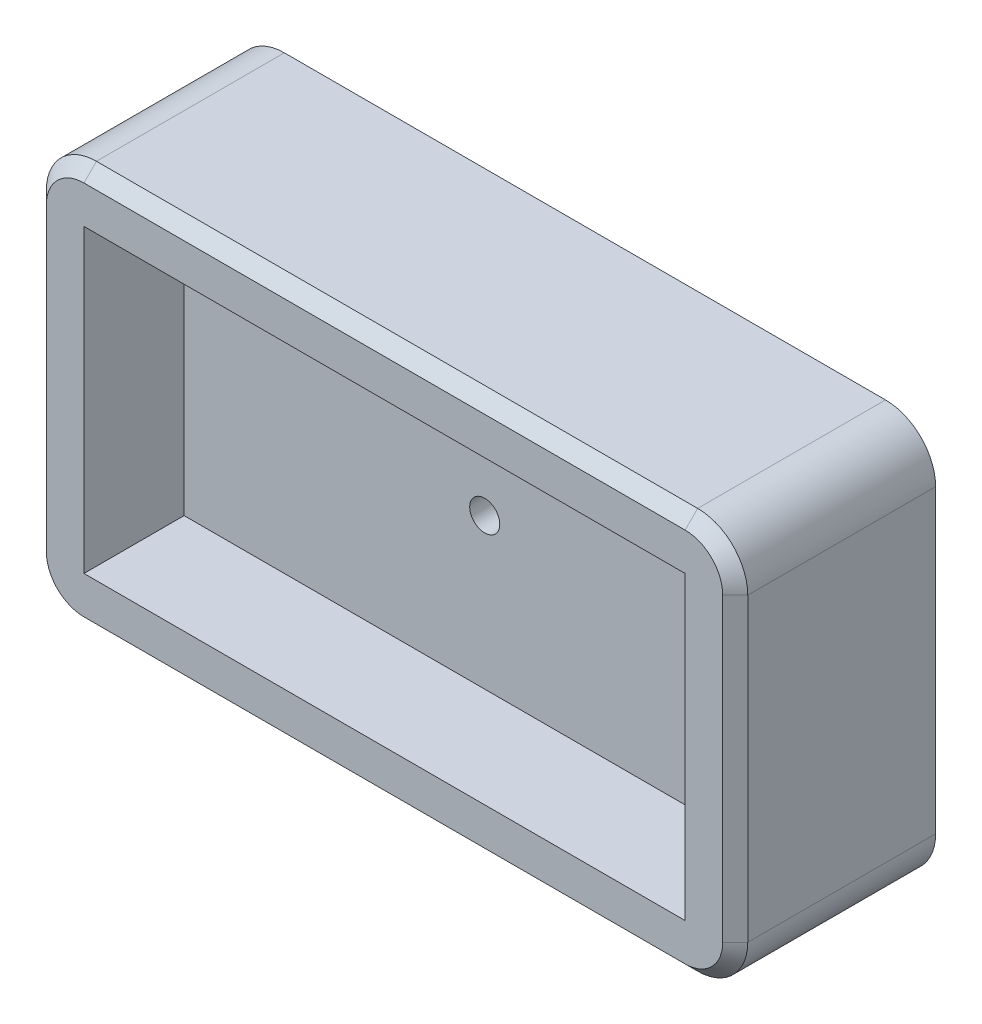
ISO-10303-21;
HEADER;
FILE_DESCRIPTION(('STEP AP214'),'2;1');
FILE_NAME('part.step','',(''),(''),'','','');
FILE_SCHEMA(('AUTOMOTIVE_DESIGN { 1 0 10303 214 1 1 1 1 }'));
ENDSEC;
DATA;
#1=APPLICATION_CONTEXT('core data for automotive mechanical design processes');
#2=APPLICATION_PROTOCOL_DEFINITION('international standard','automotive_design',2000,#1);
#3=PRODUCT_CONTEXT('',#1,'mechanical');
#4=PRODUCT('Part','Part','',(#3));
#5=PRODUCT_RELATED_PRODUCT_CATEGORY('part','',(#4));
#6=PRODUCT_DEFINITION_FORMATION('','',#4);
#7=PRODUCT_DEFINITION_CONTEXT('part definition',#1,'design');
#8=PRODUCT_DEFINITION('design','',#6,#7);
#9=PRODUCT_DEFINITION_SHAPE('','',#8);
#10=(LENGTH_UNIT() NAMED_UNIT(*) SI_UNIT(.MILLI.,.METRE.));
#11=(NAMED_UNIT(*) PLANE_ANGLE_UNIT() SI_UNIT($,.RADIAN.));
#12=(NAMED_UNIT(*) SI_UNIT($,.STERADIAN.) SOLID_ANGLE_UNIT());
#13=UNCERTAINTY_MEASURE_WITH_UNIT(LENGTH_MEASURE(1.E-05),#10,'distance_accuracy_value','');
#14=(GEOMETRIC_REPRESENTATION_CONTEXT(3) GLOBAL_UNCERTAINTY_ASSIGNED_CONTEXT((#13)) GLOBAL_UNIT_ASSIGNED_CONTEXT((#10,
#11,#12)) REPRESENTATION_CONTEXT('',''));
#15=CARTESIAN_POINT('',(0.,0.,0.));
#16=DIRECTION('',(0.,0.,1.));
#17=DIRECTION('',(1.,0.,0.));
#18=AXIS2_PLACEMENT_3D('',#15,#16,#17);
#19=CARTESIAN_POINT('',(0.,25.4,-12.7));
#20=DIRECTION('',(0.,-1.,0.));
#21=DIRECTION('',(1.,0.,0.));
#22=AXIS2_PLACEMENT_3D('',#19,#20,#21);
#23=PLANE('',#22);
#24=DIRECTION('',(0.,0.,1.));
#25=VECTOR('',#24,1.);
#26=CARTESIAN_POINT('',(-38.1,25.4,-12.7));
#27=LINE('',#26,#25);
#28=CARTESIAN_POINT('',(-38.1,25.4,-12.7));
#29=VERTEX_POINT('',#28);
#30=CARTESIAN_POINT('',(-38.1,25.4,11.1125));
#31=VERTEX_POINT('',#30);
#32=EDGE_CURVE('E248',#29,#31,#27,.T.);
#33=ORIENTED_EDGE('',*,*,#32,.T.);
#34=DIRECTION('',(1.,0.,0.));
#35=VECTOR('',#34,1.);
#36=CARTESIAN_POINT('',(0.,25.4,11.1125));
#37=LINE('',#36,#35);
#38=CARTESIAN_POINT('',(38.1,25.4,11.1125));
#39=VERTEX_POINT('',#38);
#40=EDGE_CURVE('E312',#31,#39,#37,.T.);
#41=ORIENTED_EDGE('',*,*,#40,.T.);
#42=DIRECTION('',(0.,0.,1.));
#43=VECTOR('',#42,1.);
#44=CARTESIAN_POINT('',(38.1,25.4,-12.7));
#45=LINE('',#44,#43);
#46=CARTESIAN_POINT('',(38.1,25.4,-12.7));
#47=VERTEX_POINT('',#46);
#48=EDGE_CURVE('E249',#47,#39,#45,.T.);
#49=ORIENTED_EDGE('',*,*,#48,.F.);
#50=DIRECTION('',(1.,0.,0.));
#51=VECTOR('',#50,1.);
#52=CARTESIAN_POINT('',(0.,25.4,-12.7));
#53=LINE('',#52,#51);
#54=EDGE_CURVE('E186',#29,#47,#53,.T.);
#55=ORIENTED_EDGE('',*,*,#54,.F.);
#56=EDGE_LOOP('',(#33,#41,#49,#55));
#57=FACE_BOUND('',#56,.T.);
#58=ADVANCED_FACE('F47',(#57),#23,.F.);
#59=CARTESIAN_POINT('',(38.1,19.05,-12.7));
#60=DIRECTION('',(0.,0.,1.));
#61=DIRECTION('',(1.,0.,0.));
#62=AXIS2_PLACEMENT_3D('',#59,#60,#61);
#63=CYLINDRICAL_SURFACE('',#62,6.35);
#64=ORIENTED_EDGE('',*,*,#48,.T.);
#65=CARTESIAN_POINT('',(38.1,19.05,11.1125));
#66=DIRECTION('',(0.,0.,-1.));
#67=DIRECTION('',(-1.,0.,0.));
#68=AXIS2_PLACEMENT_3D('',#65,#66,#67);
#69=CIRCLE('',#68,6.35);
#70=CARTESIAN_POINT('',(44.45,19.05,11.1125));
#71=VERTEX_POINT('',#70);
#72=EDGE_CURVE('E306',#39,#71,#69,.T.);
#73=ORIENTED_EDGE('',*,*,#72,.T.);
#74=DIRECTION('',(0.,0.,1.));
#75=VECTOR('',#74,1.);
#76=CARTESIAN_POINT('',(44.45,19.05,-12.7));
#77=LINE('',#76,#75);
#78=CARTESIAN_POINT('',(44.45,19.05,-12.7));
#79=VERTEX_POINT('',#78);
#80=EDGE_CURVE('E254',#79,#71,#77,.T.);
#81=ORIENTED_EDGE('',*,*,#80,.F.);
#82=CARTESIAN_POINT('',(38.1,19.05,-12.7));
#83=DIRECTION('',(0.,0.,1.));
#84=DIRECTION('',(1.,0.,0.));
#85=AXIS2_PLACEMENT_3D('',#82,#83,#84);
#86=CIRCLE('',#85,6.35);
#87=EDGE_CURVE('E245',#47,#79,#86,.F.);
#88=ORIENTED_EDGE('',*,*,#87,.F.);
#89=EDGE_LOOP('',(#64,#73,#81,#88));
#90=FACE_BOUND('',#89,.T.);
#91=ADVANCED_FACE('F387',(#90),#63,.T.);
#92=CARTESIAN_POINT('',(44.45,0.,-12.7));
#93=DIRECTION('',(1.,0.,0.));
#94=DIRECTION('',(0.,1.,0.));
#95=AXIS2_PLACEMENT_3D('',#92,#93,#94);
#96=PLANE('',#95);
#97=ORIENTED_EDGE('',*,*,#80,.T.);
#98=DIRECTION('',(0.,-1.,0.));
#99=VECTOR('',#98,1.);
#100=CARTESIAN_POINT('',(44.45,-19.05,11.1125));
#101=LINE('',#100,#99);
#102=CARTESIAN_POINT('',(44.45,-19.05,11.1125));
#103=VERTEX_POINT('',#102);
#104=EDGE_CURVE('E302',#71,#103,#101,.T.);
#105=ORIENTED_EDGE('',*,*,#104,.T.);
#106=DIRECTION('',(0.,0.,1.));
#107=VECTOR('',#106,1.);
#108=CARTESIAN_POINT('',(44.45,-19.05,-12.7));
#109=LINE('',#108,#107);
#110=CARTESIAN_POINT('',(44.45,-19.05,-12.7));
#111=VERTEX_POINT('',#110);
#112=EDGE_CURVE('E258',#111,#103,#109,.T.);
#113=ORIENTED_EDGE('',*,*,#112,.F.);
#114=DIRECTION('',(0.,1.,0.));
#115=VECTOR('',#114,1.);
#116=CARTESIAN_POINT('',(44.45,0.,-12.7));
#117=LINE('',#116,#115);
#118=EDGE_CURVE('E241',#111,#79,#117,.T.);
#119=ORIENTED_EDGE('',*,*,#118,.T.);
#120=EDGE_LOOP('',(#97,#105,#113,#119));
#121=FACE_BOUND('',#120,.T.);
#122=ADVANCED_FACE('F393',(#121),#96,.T.);
#123=CARTESIAN_POINT('',(38.1,-19.05,-12.7));
#124=DIRECTION('',(0.,0.,1.));
#125=DIRECTION('',(1.,0.,0.));
#126=AXIS2_PLACEMENT_3D('',#123,#124,#125);
#127=CYLINDRICAL_SURFACE('',#126,6.35);
#128=ORIENTED_EDGE('',*,*,#112,.T.);
#129=CARTESIAN_POINT('',(38.1,-19.05,11.1125));
#130=DIRECTION('',(0.,0.,-1.));
#131=DIRECTION('',(-1.,0.,0.));
#132=AXIS2_PLACEMENT_3D('',#129,#130,#131);
#133=CIRCLE('',#132,6.35);
#134=CARTESIAN_POINT('',(38.1,-25.4,11.1125));
#135=VERTEX_POINT('',#134);
#136=EDGE_CURVE('E309',#103,#135,#133,.T.);
#137=ORIENTED_EDGE('',*,*,#136,.T.);
#138=DIRECTION('',(0.,0.,1.));
#139=VECTOR('',#138,1.);
#140=CARTESIAN_POINT('',(38.1,-25.4,-12.7));
#141=LINE('',#140,#139);
#142=CARTESIAN_POINT('',(38.1,-25.4,-12.7));
#143=VERTEX_POINT('',#142);
#144=EDGE_CURVE('E262',#143,#135,#141,.T.);
#145=ORIENTED_EDGE('',*,*,#144,.F.);
#146=CARTESIAN_POINT('',(38.1,-19.05,-12.7));
#147=DIRECTION('',(0.,0.,1.));
#148=DIRECTION('',(1.,0.,0.));
#149=AXIS2_PLACEMENT_3D('',#146,#147,#148);
#150=CIRCLE('',#149,6.35);
#151=EDGE_CURVE('E238',#111,#143,#150,.F.);
#152=ORIENTED_EDGE('',*,*,#151,.F.);
#153=EDGE_LOOP('',(#128,#137,#145,#152));
#154=FACE_BOUND('',#153,.T.);
#155=ADVANCED_FACE('F466',(#154),#127,.T.);
#156=CARTESIAN_POINT('',(0.,-25.4,-12.7));
#157=DIRECTION('',(0.,-1.,0.));
#158=DIRECTION('',(0.,0.,-1.));
#159=AXIS2_PLACEMENT_3D('',#156,#157,#158);
#160=PLANE('',#159);
#161=ORIENTED_EDGE('',*,*,#144,.T.);
#162=DIRECTION('',(-1.,0.,0.));
#163=VECTOR('',#162,1.);
#164=CARTESIAN_POINT('',(-38.1,-25.4,11.1125));
#165=LINE('',#164,#163);
#166=CARTESIAN_POINT('',(-38.1,-25.4,11.1125));
#167=VERTEX_POINT('',#166);
#168=EDGE_CURVE('E315',#135,#167,#165,.T.);
#169=ORIENTED_EDGE('',*,*,#168,.T.);
#170=DIRECTION('',(0.,0.,1.));
#171=VECTOR('',#170,1.);
#172=CARTESIAN_POINT('',(-38.1,-25.4,-12.7));
#173=LINE('',#172,#171);
#174=CARTESIAN_POINT('',(-38.1,-25.4,-12.7));
#175=VERTEX_POINT('',#174);
#176=EDGE_CURVE('E266',#175,#167,#173,.T.);
#177=ORIENTED_EDGE('',*,*,#176,.F.);
#178=DIRECTION('',(1.,0.,0.));
#179=VECTOR('',#178,1.);
#180=CARTESIAN_POINT('',(0.,-25.4,-12.7));
#181=LINE('',#180,#179);
#182=EDGE_CURVE('E234',#175,#143,#181,.T.);
#183=ORIENTED_EDGE('',*,*,#182,.T.);
#184=EDGE_LOOP('',(#161,#169,#177,#183));
#185=FACE_BOUND('',#184,.T.);
#186=ADVANCED_FACE('F384',(#185),#160,.T.);
#187=CARTESIAN_POINT('',(-38.1,-19.05,-12.7));
#188=DIRECTION('',(0.,0.,1.));
#189=DIRECTION('',(1.,0.,0.));
#190=AXIS2_PLACEMENT_3D('',#187,#188,#189);
#191=CYLINDRICAL_SURFACE('',#190,6.35);
#192=ORIENTED_EDGE('',*,*,#176,.T.);
#193=CARTESIAN_POINT('',(-38.1,-19.05,11.1125));
#194=DIRECTION('',(0.,0.,-1.));
#195=DIRECTION('',(-1.,0.,0.));
#196=AXIS2_PLACEMENT_3D('',#193,#194,#195);
#197=CIRCLE('',#196,6.35);
#198=CARTESIAN_POINT('',(-44.45,-19.05,11.1125));
#199=VERTEX_POINT('',#198);
#200=EDGE_CURVE('E58',#167,#199,#197,.T.);
#201=ORIENTED_EDGE('',*,*,#200,.T.);
#202=DIRECTION('',(0.,0.,1.));
#203=VECTOR('',#202,1.);
#204=CARTESIAN_POINT('',(-44.45,-19.05,-12.7));
#205=LINE('',#204,#203);
#206=CARTESIAN_POINT('',(-44.45,-19.05,-12.7));
#207=VERTEX_POINT('',#206);
#208=EDGE_CURVE('E269',#207,#199,#205,.T.);
#209=ORIENTED_EDGE('',*,*,#208,.F.);
#210=CARTESIAN_POINT('',(-38.1,-19.05,-12.7));
#211=DIRECTION('',(0.,0.,1.));
#212=DIRECTION('',(1.,0.,0.));
#213=AXIS2_PLACEMENT_3D('',#210,#211,#212);
#214=CIRCLE('',#213,6.35);
#215=EDGE_CURVE('E231',#175,#207,#214,.F.);
#216=ORIENTED_EDGE('',*,*,#215,.F.);
#217=EDGE_LOOP('',(#192,#201,#209,#216));
#218=FACE_BOUND('',#217,.T.);
#219=ADVANCED_FACE('F377',(#218),#191,.T.);
#220=CARTESIAN_POINT('',(-44.45,0.,-12.7));
#221=DIRECTION('',(1.,0.,0.));
#222=DIRECTION('',(0.,0.,-1.));
#223=AXIS2_PLACEMENT_3D('',#220,#221,#222);
#224=PLANE('',#223);
#225=ORIENTED_EDGE('',*,*,#208,.T.);
#226=DIRECTION('',(0.,1.,0.));
#227=VECTOR('',#226,1.);
#228=CARTESIAN_POINT('',(-44.45,0.,11.1125));
#229=LINE('',#228,#227);
#230=CARTESIAN_POINT('',(-44.45,19.05,11.1125));
#231=VERTEX_POINT('',#230);
#232=EDGE_CURVE('E11',#199,#231,#229,.T.);
#233=ORIENTED_EDGE('',*,*,#232,.T.);
#234=DIRECTION('',(0.,0.,1.));
#235=VECTOR('',#234,1.);
#236=CARTESIAN_POINT('',(-44.45,19.05,-12.7));
#237=LINE('',#236,#235);
#238=CARTESIAN_POINT('',(-44.45,19.05,-12.7));
#239=VERTEX_POINT('',#238);
#240=EDGE_CURVE('E272',#239,#231,#237,.T.);
#241=ORIENTED_EDGE('',*,*,#240,.F.);
#242=DIRECTION('',(0.,1.,0.));
#243=VECTOR('',#242,1.);
#244=CARTESIAN_POINT('',(-44.45,0.,-12.7));
#245=LINE('',#244,#243);
#246=EDGE_CURVE('E228',#207,#239,#245,.T.);
#247=ORIENTED_EDGE('',*,*,#246,.F.);
#248=EDGE_LOOP('',(#225,#233,#241,#247));
#249=FACE_BOUND('',#248,.T.);
#250=ADVANCED_FACE('F375',(#249),#224,.F.);
#251=CARTESIAN_POINT('',(-38.1,19.05,-12.7));
#252=DIRECTION('',(0.,0.,1.));
#253=DIRECTION('',(1.,0.,0.));
#254=AXIS2_PLACEMENT_3D('',#251,#252,#253);
#255=CYLINDRICAL_SURFACE('',#254,6.35);
#256=ORIENTED_EDGE('',*,*,#240,.T.);
#257=CARTESIAN_POINT('',(-38.1,19.05,11.1125));
#258=DIRECTION('',(0.,0.,-1.));
#259=DIRECTION('',(-1.,0.,0.));
#260=AXIS2_PLACEMENT_3D('',#257,#258,#259);
#261=CIRCLE('',#260,6.35);
#262=EDGE_CURVE('E318',#231,#31,#261,.T.);
#263=ORIENTED_EDGE('',*,*,#262,.T.);
#264=ORIENTED_EDGE('',*,*,#32,.F.);
#265=CARTESIAN_POINT('',(-38.1,19.05,-12.7));
#266=DIRECTION('',(0.,0.,1.));
#267=DIRECTION('',(1.,0.,0.));
#268=AXIS2_PLACEMENT_3D('',#265,#266,#267);
#269=CIRCLE('',#268,6.35);
#270=EDGE_CURVE('E224',#29,#239,#269,.T.);
#271=ORIENTED_EDGE('',*,*,#270,.T.);
#272=EDGE_LOOP('',(#256,#263,#264,#271));
#273=FACE_BOUND('',#272,.T.);
#274=ADVANCED_FACE('F365',(#273),#255,.T.);
#275=CARTESIAN_POINT('',(0.,0.,-12.7));
#276=DIRECTION('',(0.,0.,1.));
#277=DIRECTION('',(1.,0.,0.));
#278=AXIS2_PLACEMENT_3D('',#275,#276,#277);
#279=PLANE('',#278);
#280=CARTESIAN_POINT('',(0.,0.,-12.7));
#281=DIRECTION('',(0.,0.,-1.));
#282=DIRECTION('',(-1.,0.,0.));
#283=AXIS2_PLACEMENT_3D('',#280,#281,#282);
#284=CIRCLE('',#283,1.905);
#285=CARTESIAN_POINT('',(-1.905,0.,-12.7));
#286=VERTEX_POINT('',#285);
#287=EDGE_CURVE('E511',#286,#286,#284,.T.);
#288=ORIENTED_EDGE('',*,*,#287,.F.);
#289=EDGE_LOOP('',(#288));
#290=FACE_BOUND('',#289,.T.);
#291=ORIENTED_EDGE('',*,*,#54,.T.);
#292=ORIENTED_EDGE('',*,*,#87,.T.);
#293=ORIENTED_EDGE('',*,*,#118,.F.);
#294=ORIENTED_EDGE('',*,*,#151,.T.);
#295=ORIENTED_EDGE('',*,*,#182,.F.);
#296=ORIENTED_EDGE('',*,*,#215,.T.);
#297=ORIENTED_EDGE('',*,*,#246,.T.);
#298=ORIENTED_EDGE('',*,*,#270,.F.);
#299=EDGE_LOOP('',(#291,#292,#293,#294,#295,#296,#297,#298));
#300=FACE_BOUND('',#299,.T.);
#301=ADVANCED_FACE('F371',(#290,#300),#279,.F.);
#302=CARTESIAN_POINT('',(-38.1,-19.05,12.7));
#303=DIRECTION('',(0.,0.,-1.));
#304=DIRECTION('',(-1.,0.,0.));
#305=AXIS2_PLACEMENT_3D('',#302,#303,#304);
#306=PLANE('',#305);
#307=CARTESIAN_POINT('',(38.1,-19.05,12.7));
#308=DIRECTION('',(0.,0.,-1.));
#309=DIRECTION('',(-1.,0.,0.));
#310=AXIS2_PLACEMENT_3D('',#307,#308,#309);
#311=CIRCLE('',#310,4.7625);
#312=CARTESIAN_POINT('',(38.1,-23.8125,12.7));
#313=VERTEX_POINT('',#312);
#314=CARTESIAN_POINT('',(42.8625,-19.05,12.7));
#315=VERTEX_POINT('',#314);
#316=EDGE_CURVE('E292',#313,#315,#311,.F.);
#317=ORIENTED_EDGE('',*,*,#316,.T.);
#318=DIRECTION('',(0.,1.,0.));
#319=VECTOR('',#318,1.);
#320=CARTESIAN_POINT('',(42.8625,19.05,12.7));
#321=LINE('',#320,#319);
#322=CARTESIAN_POINT('',(42.8625,19.05,12.7));
#323=VERTEX_POINT('',#322);
#324=EDGE_CURVE('E298',#315,#323,#321,.T.);
#325=ORIENTED_EDGE('',*,*,#324,.T.);
#326=CARTESIAN_POINT('',(38.1,19.05,12.7));
#327=DIRECTION('',(0.,0.,-1.));
#328=DIRECTION('',(-1.,0.,0.));
#329=AXIS2_PLACEMENT_3D('',#326,#327,#328);
#330=CIRCLE('',#329,4.7625);
#331=CARTESIAN_POINT('',(38.1,23.8125,12.7));
#332=VERTEX_POINT('',#331);
#333=EDGE_CURVE('E295',#323,#332,#330,.F.);
#334=ORIENTED_EDGE('',*,*,#333,.T.);
#335=DIRECTION('',(-1.,0.,0.));
#336=VECTOR('',#335,1.);
#337=CARTESIAN_POINT('',(-38.1,23.8125,12.7));
#338=LINE('',#337,#336);
#339=CARTESIAN_POINT('',(-38.1,23.8125,12.7));
#340=VERTEX_POINT('',#339);
#341=EDGE_CURVE('E289',#332,#340,#338,.T.);
#342=ORIENTED_EDGE('',*,*,#341,.T.);
#343=CARTESIAN_POINT('',(-38.1,19.05,12.7));
#344=DIRECTION('',(0.,0.,-1.));
#345=DIRECTION('',(-1.,0.,0.));
#346=AXIS2_PLACEMENT_3D('',#343,#344,#345);
#347=CIRCLE('',#346,4.7625);
#348=CARTESIAN_POINT('',(-42.8625,19.05,12.7));
#349=VERTEX_POINT('',#348);
#350=EDGE_CURVE('E283',#340,#349,#347,.F.);
#351=ORIENTED_EDGE('',*,*,#350,.T.);
#352=DIRECTION('',(0.,-1.,0.));
#353=VECTOR('',#352,1.);
#354=CARTESIAN_POINT('',(-42.8625,-19.05,12.7));
#355=LINE('',#354,#353);
#356=CARTESIAN_POINT('',(-42.8625,-19.05,12.7));
#357=VERTEX_POINT('',#356);
#358=EDGE_CURVE('E253',#349,#357,#355,.T.);
#359=ORIENTED_EDGE('',*,*,#358,.T.);
#360=CARTESIAN_POINT('',(-38.1,-19.05,12.7));
#361=DIRECTION('',(0.,0.,-1.));
#362=DIRECTION('',(-1.,0.,0.));
#363=AXIS2_PLACEMENT_3D('',#360,#361,#362);
#364=CIRCLE('',#363,4.7625);
#365=CARTESIAN_POINT('',(-38.1,-23.8125,12.7));
#366=VERTEX_POINT('',#365);
#367=EDGE_CURVE('E280',#357,#366,#364,.F.);
#368=ORIENTED_EDGE('',*,*,#367,.T.);
#369=DIRECTION('',(1.,0.,0.));
#370=VECTOR('',#369,1.);
#371=CARTESIAN_POINT('',(38.1,-23.8125,12.7));
#372=LINE('',#371,#370);
#373=EDGE_CURVE('E286',#366,#313,#372,.T.);
#374=ORIENTED_EDGE('',*,*,#373,.T.);
#375=EDGE_LOOP('',(#317,#325,#334,#342,#351,#359,#368,#374));
#376=FACE_BOUND('',#375,.T.);
#377=DIRECTION('',(0.,1.,0.));
#378=VECTOR('',#377,1.);
#379=CARTESIAN_POINT('',(38.1,-19.05,12.7));
#380=LINE('',#379,#378);
#381=CARTESIAN_POINT('',(38.1,-19.05,12.7));
#382=VERTEX_POINT('',#381);
#383=CARTESIAN_POINT('',(38.1,19.05,12.7));
#384=VERTEX_POINT('',#383);
#385=EDGE_CURVE('E165',#382,#384,#380,.T.);
#386=ORIENTED_EDGE('',*,*,#385,.F.);
#387=DIRECTION('',(1.,0.,0.));
#388=VECTOR('',#387,1.);
#389=CARTESIAN_POINT('',(-38.1,-19.05,12.7));
#390=LINE('',#389,#388);
#391=CARTESIAN_POINT('',(-38.1,-19.05,12.7));
#392=VERTEX_POINT('',#391);
#393=EDGE_CURVE('E196',#392,#382,#390,.T.);
#394=ORIENTED_EDGE('',*,*,#393,.F.);
#395=DIRECTION('',(0.,-1.,0.));
#396=VECTOR('',#395,1.);
#397=CARTESIAN_POINT('',(-38.1,-19.05,12.7));
#398=LINE('',#397,#396);
#399=CARTESIAN_POINT('',(-38.1,19.05,12.7));
#400=VERTEX_POINT('',#399);
#401=EDGE_CURVE('E192',#400,#392,#398,.T.);
#402=ORIENTED_EDGE('',*,*,#401,.F.);
#403=DIRECTION('',(-1.,0.,0.));
#404=VECTOR('',#403,1.);
#405=CARTESIAN_POINT('',(-38.1,19.05,12.7));
#406=LINE('',#405,#404);
#407=EDGE_CURVE('E176',#384,#400,#406,.T.);
#408=ORIENTED_EDGE('',*,*,#407,.F.);
#409=EDGE_LOOP('',(#386,#394,#402,#408));
#410=FACE_BOUND('',#409,.T.);
#411=ADVANCED_FACE('F190',(#376,#410),#306,.F.);
#412=CARTESIAN_POINT('',(38.1,-19.05,12.7));
#413=DIRECTION('',(-1.,0.,0.));
#414=DIRECTION('',(0.,0.,1.));
#415=AXIS2_PLACEMENT_3D('',#412,#413,#414);
#416=PLANE('',#415);
#417=DIRECTION('',(0.,1.,0.));
#418=VECTOR('',#417,1.);
#419=CARTESIAN_POINT('',(38.1,-19.05,0.));
#420=LINE('',#419,#418);
#421=CARTESIAN_POINT('',(38.1,-19.05,0.));
#422=VERTEX_POINT('',#421);
#423=CARTESIAN_POINT('',(38.1,19.05,0.));
#424=VERTEX_POINT('',#423);
#425=EDGE_CURVE('E202',#422,#424,#420,.T.);
#426=ORIENTED_EDGE('',*,*,#425,.F.);
#427=DIRECTION('',(0.,0.,-1.));
#428=VECTOR('',#427,1.);
#429=CARTESIAN_POINT('',(38.1,-19.05,12.7));
#430=LINE('',#429,#428);
#431=EDGE_CURVE('E171',#382,#422,#430,.T.);
#432=ORIENTED_EDGE('',*,*,#431,.F.);
#433=ORIENTED_EDGE('',*,*,#385,.T.);
#434=DIRECTION('',(0.,0.,-1.));
#435=VECTOR('',#434,1.);
#436=CARTESIAN_POINT('',(38.1,19.05,12.7));
#437=LINE('',#436,#435);
#438=EDGE_CURVE('E169',#384,#424,#437,.T.);
#439=ORIENTED_EDGE('',*,*,#438,.T.);
#440=EDGE_LOOP('',(#426,#432,#433,#439));
#441=FACE_BOUND('',#440,.T.);
#442=ADVANCED_FACE('F168',(#441),#416,.T.);
#443=CARTESIAN_POINT('',(-38.1,19.05,12.7));
#444=DIRECTION('',(0.,-1.,0.));
#445=DIRECTION('',(0.,0.,-1.));
#446=AXIS2_PLACEMENT_3D('',#443,#444,#445);
#447=PLANE('',#446);
#448=DIRECTION('',(-1.,0.,0.));
#449=VECTOR('',#448,1.);
#450=CARTESIAN_POINT('',(-38.1,19.05,0.));
#451=LINE('',#450,#449);
#452=CARTESIAN_POINT('',(-38.1,19.05,0.));
#453=VERTEX_POINT('',#452);
#454=EDGE_CURVE('E184',#424,#453,#451,.T.);
#455=ORIENTED_EDGE('',*,*,#454,.F.);
#456=ORIENTED_EDGE('',*,*,#438,.F.);
#457=ORIENTED_EDGE('',*,*,#407,.T.);
#458=DIRECTION('',(0.,0.,-1.));
#459=VECTOR('',#458,1.);
#460=CARTESIAN_POINT('',(-38.1,19.05,12.7));
#461=LINE('',#460,#459);
#462=EDGE_CURVE('E187',#400,#453,#461,.T.);
#463=ORIENTED_EDGE('',*,*,#462,.T.);
#464=EDGE_LOOP('',(#455,#456,#457,#463));
#465=FACE_BOUND('',#464,.T.);
#466=ADVANCED_FACE('F181',(#465),#447,.T.);
#467=CARTESIAN_POINT('',(-38.1,-19.05,12.7));
#468=DIRECTION('',(1.,0.,0.));
#469=DIRECTION('',(0.,0.,-1.));
#470=AXIS2_PLACEMENT_3D('',#467,#468,#469);
#471=PLANE('',#470);
#472=DIRECTION('',(0.,-1.,0.));
#473=VECTOR('',#472,1.);
#474=CARTESIAN_POINT('',(-38.1,-19.05,0.));
#475=LINE('',#474,#473);
#476=CARTESIAN_POINT('',(-38.1,-19.05,0.));
#477=VERTEX_POINT('',#476);
#478=EDGE_CURVE('E208',#453,#477,#475,.T.);
#479=ORIENTED_EDGE('',*,*,#478,.F.);
#480=ORIENTED_EDGE('',*,*,#462,.F.);
#481=ORIENTED_EDGE('',*,*,#401,.T.);
#482=DIRECTION('',(0.,0.,-1.));
#483=VECTOR('',#482,1.);
#484=CARTESIAN_POINT('',(-38.1,-19.05,12.7));
#485=LINE('',#484,#483);
#486=EDGE_CURVE('E215',#392,#477,#485,.T.);
#487=ORIENTED_EDGE('',*,*,#486,.T.);
#488=EDGE_LOOP('',(#479,#480,#481,#487));
#489=FACE_BOUND('',#488,.T.);
#490=ADVANCED_FACE('F456',(#489),#471,.T.);
#491=CARTESIAN_POINT('',(-38.1,-19.05,12.7));
#492=DIRECTION('',(0.,1.,0.));
#493=DIRECTION('',(0.,0.,1.));
#494=AXIS2_PLACEMENT_3D('',#491,#492,#493);
#495=PLANE('',#494);
#496=DIRECTION('',(1.,0.,0.));
#497=VECTOR('',#496,1.);
#498=CARTESIAN_POINT('',(-38.1,-19.05,0.));
#499=LINE('',#498,#497);
#500=EDGE_CURVE('E177',#477,#422,#499,.T.);
#501=ORIENTED_EDGE('',*,*,#500,.F.);
#502=ORIENTED_EDGE('',*,*,#486,.F.);
#503=ORIENTED_EDGE('',*,*,#393,.T.);
#504=ORIENTED_EDGE('',*,*,#431,.T.);
#505=EDGE_LOOP('',(#501,#502,#503,#504));
#506=FACE_BOUND('',#505,.T.);
#507=ADVANCED_FACE('F449',(#506),#495,.T.);
#508=CARTESIAN_POINT('',(0.,0.,0.));
#509=DIRECTION('',(0.,0.,1.));
#510=DIRECTION('',(1.,0.,0.));
#511=AXIS2_PLACEMENT_3D('',#508,#509,#510);
#512=PLANE('',#511);
#513=CARTESIAN_POINT('',(0.,0.,0.));
#514=DIRECTION('',(0.,0.,1.));
#515=DIRECTION('',(1.,0.,0.));
#516=AXIS2_PLACEMENT_3D('',#513,#514,#515);
#517=CIRCLE('',#516,1.905);
#518=CARTESIAN_POINT('',(1.905,0.,0.));
#519=VERTEX_POINT('',#518);
#520=EDGE_CURVE('E52',#519,#519,#517,.T.);
#521=ORIENTED_EDGE('',*,*,#520,.F.);
#522=EDGE_LOOP('',(#521));
#523=FACE_BOUND('',#522,.T.);
#524=ORIENTED_EDGE('',*,*,#425,.T.);
#525=ORIENTED_EDGE('',*,*,#454,.T.);
#526=ORIENTED_EDGE('',*,*,#478,.T.);
#527=ORIENTED_EDGE('',*,*,#500,.T.);
#528=EDGE_LOOP('',(#524,#525,#526,#527));
#529=FACE_BOUND('',#528,.T.);
#530=ADVANCED_FACE('F444',(#523,#529),#512,.T.);
#531=CARTESIAN_POINT('',(-42.8625,-19.05,12.7));
#532=DIRECTION('',(0.707106781186548,0.,-0.707106781186548));
#533=DIRECTION('',(0.,-1.,0.));
#534=AXIS2_PLACEMENT_3D('',#531,#532,#533);
#535=PLANE('',#534);
#536=DIRECTION('',(0.707106781186548,0.,0.707106781186548));
#537=VECTOR('',#536,1.);
#538=CARTESIAN_POINT('',(-44.45,19.05,11.1125));
#539=LINE('',#538,#537);
#540=EDGE_CURVE('E345',#231,#349,#539,.T.);
#541=ORIENTED_EDGE('',*,*,#540,.F.);
#542=ORIENTED_EDGE('',*,*,#232,.F.);
#543=DIRECTION('',(-0.707106781186548,0.,-0.707106781186548));
#544=VECTOR('',#543,1.);
#545=CARTESIAN_POINT('',(-42.8625,-19.05,12.7));
#546=LINE('',#545,#544);
#547=EDGE_CURVE('E205',#357,#199,#546,.T.);
#548=ORIENTED_EDGE('',*,*,#547,.F.);
#549=ORIENTED_EDGE('',*,*,#358,.F.);
#550=EDGE_LOOP('',(#541,#542,#548,#549));
#551=FACE_BOUND('',#550,.T.);
#552=ADVANCED_FACE('F50',(#551),#535,.F.);
#553=CARTESIAN_POINT('',(-38.1,-19.05,12.7));
#554=DIRECTION('',(0.,0.,-1.));
#555=DIRECTION('',(-1.,0.,0.));
#556=AXIS2_PLACEMENT_3D('',#553,#554,#555);
#557=CONICAL_SURFACE('',#556,4.7625,0.785398163397448);
#558=ORIENTED_EDGE('',*,*,#547,.T.);
#559=ORIENTED_EDGE('',*,*,#200,.F.);
#560=DIRECTION('',(0.,-0.707106781186547,-0.707106781186548));
#561=VECTOR('',#560,1.);
#562=CARTESIAN_POINT('',(-38.1,-23.8125,12.7));
#563=LINE('',#562,#561);
#564=EDGE_CURVE('E341',#366,#167,#563,.T.);
#565=ORIENTED_EDGE('',*,*,#564,.F.);
#566=ORIENTED_EDGE('',*,*,#367,.F.);
#567=EDGE_LOOP('',(#558,#559,#565,#566));
#568=FACE_BOUND('',#567,.T.);
#569=ADVANCED_FACE('F353',(#568),#557,.T.);
#570=CARTESIAN_POINT('',(-38.1,19.05,12.7));
#571=DIRECTION('',(0.,0.,-1.));
#572=DIRECTION('',(-1.,0.,0.));
#573=AXIS2_PLACEMENT_3D('',#570,#571,#572);
#574=CONICAL_SURFACE('',#573,4.7625,0.785398163397448);
#575=ORIENTED_EDGE('',*,*,#540,.T.);
#576=ORIENTED_EDGE('',*,*,#350,.F.);
#577=DIRECTION('',(0.,-0.707106781186547,0.707106781186548));
#578=VECTOR('',#577,1.);
#579=CARTESIAN_POINT('',(-38.1,25.4,11.1125));
#580=LINE('',#579,#578);
#581=EDGE_CURVE('E337',#31,#340,#580,.T.);
#582=ORIENTED_EDGE('',*,*,#581,.F.);
#583=ORIENTED_EDGE('',*,*,#262,.F.);
#584=EDGE_LOOP('',(#575,#576,#582,#583));
#585=FACE_BOUND('',#584,.T.);
#586=ADVANCED_FACE('F362',(#585),#574,.T.);
#587=CARTESIAN_POINT('',(-38.1,-23.8125,12.7));
#588=DIRECTION('',(0.,-0.707106781186548,0.707106781186548));
#589=DIRECTION('',(-1.,0.,0.));
#590=AXIS2_PLACEMENT_3D('',#587,#588,#589);
#591=PLANE('',#590);
#592=ORIENTED_EDGE('',*,*,#564,.T.);
#593=ORIENTED_EDGE('',*,*,#168,.F.);
#594=DIRECTION('',(0.,-0.707106781186548,-0.707106781186548));
#595=VECTOR('',#594,1.);
#596=CARTESIAN_POINT('',(38.1,-23.8125,12.7));
#597=LINE('',#596,#595);
#598=EDGE_CURVE('E333',#313,#135,#597,.T.);
#599=ORIENTED_EDGE('',*,*,#598,.F.);
#600=ORIENTED_EDGE('',*,*,#373,.F.);
#601=EDGE_LOOP('',(#592,#593,#599,#600));
#602=FACE_BOUND('',#601,.T.);
#603=ADVANCED_FACE('F426',(#602),#591,.T.);
#604=CARTESIAN_POINT('',(-38.1,23.8125,12.7));
#605=DIRECTION('',(0.,-0.707106781186548,-0.707106781186547));
#606=DIRECTION('',(-1.,0.,0.));
#607=AXIS2_PLACEMENT_3D('',#604,#605,#606);
#608=PLANE('',#607);
#609=ORIENTED_EDGE('',*,*,#581,.T.);
#610=ORIENTED_EDGE('',*,*,#341,.F.);
#611=DIRECTION('',(0.,-0.707106781186548,0.707106781186548));
#612=VECTOR('',#611,1.);
#613=CARTESIAN_POINT('',(38.1,25.4,11.1125));
#614=LINE('',#613,#612);
#615=EDGE_CURVE('E329',#39,#332,#614,.T.);
#616=ORIENTED_EDGE('',*,*,#615,.F.);
#617=ORIENTED_EDGE('',*,*,#40,.F.);
#618=EDGE_LOOP('',(#609,#610,#616,#617));
#619=FACE_BOUND('',#618,.T.);
#620=ADVANCED_FACE('F419',(#619),#608,.F.);
#621=CARTESIAN_POINT('',(38.1,-19.05,12.7));
#622=DIRECTION('',(0.,0.,-1.));
#623=DIRECTION('',(-1.,0.,0.));
#624=AXIS2_PLACEMENT_3D('',#621,#622,#623);
#625=CONICAL_SURFACE('',#624,4.76249999999999,0.785398163397448);
#626=ORIENTED_EDGE('',*,*,#598,.T.);
#627=ORIENTED_EDGE('',*,*,#136,.F.);
#628=DIRECTION('',(0.707106781186546,0.,-0.707106781186549));
#629=VECTOR('',#628,1.);
#630=CARTESIAN_POINT('',(42.8625,-19.05,12.7));
#631=LINE('',#630,#629);
#632=EDGE_CURVE('E326',#315,#103,#631,.T.);
#633=ORIENTED_EDGE('',*,*,#632,.F.);
#634=ORIENTED_EDGE('',*,*,#316,.F.);
#635=EDGE_LOOP('',(#626,#627,#633,#634));
#636=FACE_BOUND('',#635,.T.);
#637=ADVANCED_FACE('F412',(#636),#625,.T.);
#638=CARTESIAN_POINT('',(38.1,19.05,12.7));
#639=DIRECTION('',(0.,0.,-1.));
#640=DIRECTION('',(-1.,0.,0.));
#641=AXIS2_PLACEMENT_3D('',#638,#639,#640);
#642=CONICAL_SURFACE('',#641,4.7625,0.785398163397448);
#643=ORIENTED_EDGE('',*,*,#615,.T.);
#644=ORIENTED_EDGE('',*,*,#333,.F.);
#645=DIRECTION('',(-0.707106781186548,0.,0.707106781186548));
#646=VECTOR('',#645,1.);
#647=CARTESIAN_POINT('',(44.45,19.05,11.1125));
#648=LINE('',#647,#646);
#649=EDGE_CURVE('E323',#71,#323,#648,.T.);
#650=ORIENTED_EDGE('',*,*,#649,.F.);
#651=ORIENTED_EDGE('',*,*,#72,.F.);
#652=EDGE_LOOP('',(#643,#644,#650,#651));
#653=FACE_BOUND('',#652,.T.);
#654=ADVANCED_FACE('F405',(#653),#642,.T.);
#655=CARTESIAN_POINT('',(42.8625,-19.05,12.7));
#656=DIRECTION('',(0.707106781186547,0.,0.707106781186548));
#657=DIRECTION('',(0.,-1.,0.));
#658=AXIS2_PLACEMENT_3D('',#655,#656,#657);
#659=PLANE('',#658);
#660=ORIENTED_EDGE('',*,*,#632,.T.);
#661=ORIENTED_EDGE('',*,*,#104,.F.);
#662=ORIENTED_EDGE('',*,*,#649,.T.);
#663=ORIENTED_EDGE('',*,*,#324,.F.);
#664=EDGE_LOOP('',(#660,#661,#662,#663));
#665=FACE_BOUND('',#664,.T.);
#666=ADVANCED_FACE('F398',(#665),#659,.T.);
#667=CARTESIAN_POINT('',(0.,0.,12.7));
#668=DIRECTION('',(0.,0.,-1.));
#669=DIRECTION('',(-1.,0.,0.));
#670=AXIS2_PLACEMENT_3D('',#667,#668,#669);
#671=CYLINDRICAL_SURFACE('',#670,1.905);
#672=ORIENTED_EDGE('',*,*,#520,.T.);
#673=EDGE_LOOP('',(#672));
#674=FACE_BOUND('',#673,.T.);
#675=ORIENTED_EDGE('',*,*,#287,.T.);
#676=EDGE_LOOP('',(#675));
#677=FACE_BOUND('',#676,.T.);
#678=ADVANCED_FACE('F404',(#674,#677),#671,.F.);
#679=CLOSED_SHELL('',(#58,#91,#122,#155,#186,#219,#250,#274,#301,#411,#442,#466,#490,#507,#530,
#552,#569,#586,#603,#620,#637,#654,#666,#678));
#680=MANIFOLD_SOLID_BREP('B2',#679);
#681=ADVANCED_BREP_SHAPE_REPRESENTATION('',(#18,#680),#14);
#682=SHAPE_DEFINITION_REPRESENTATION(#9,#681);
ENDSEC;
END-ISO-10303-21;
